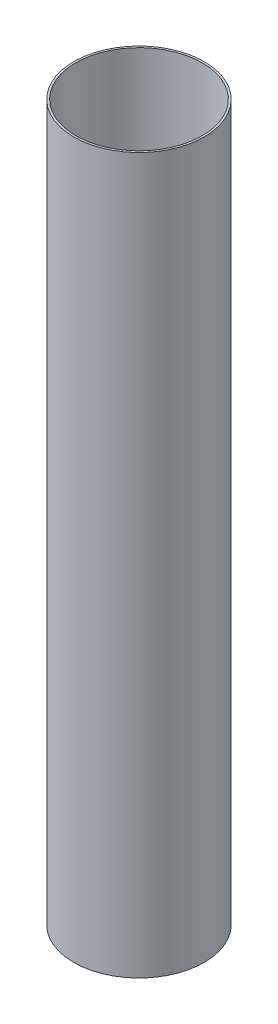
ISO-10303-21;
HEADER;
FILE_DESCRIPTION(('STEP AP214'),'2;1');
FILE_NAME('part.step','',(''),(''),'','','');
FILE_SCHEMA(('AUTOMOTIVE_DESIGN { 1 0 10303 214 1 1 1 1 }'));
ENDSEC;
DATA;
#1=APPLICATION_CONTEXT('core data for automotive mechanical design processes');
#2=APPLICATION_PROTOCOL_DEFINITION('international standard','automotive_design',2000,#1);
#3=PRODUCT_CONTEXT('',#1,'mechanical');
#4=PRODUCT('Part','Part','',(#3));
#5=PRODUCT_RELATED_PRODUCT_CATEGORY('part','',(#4));
#6=PRODUCT_DEFINITION_FORMATION('','',#4);
#7=PRODUCT_DEFINITION_CONTEXT('part definition',#1,'design');
#8=PRODUCT_DEFINITION('design','',#6,#7);
#9=PRODUCT_DEFINITION_SHAPE('','',#8);
#10=(LENGTH_UNIT() NAMED_UNIT(*) SI_UNIT(.MILLI.,.METRE.));
#11=(NAMED_UNIT(*) PLANE_ANGLE_UNIT() SI_UNIT($,.RADIAN.));
#12=(NAMED_UNIT(*) SI_UNIT($,.STERADIAN.) SOLID_ANGLE_UNIT());
#13=UNCERTAINTY_MEASURE_WITH_UNIT(LENGTH_MEASURE(1.E-05),#10,'distance_accuracy_value','');
#14=(GEOMETRIC_REPRESENTATION_CONTEXT(3) GLOBAL_UNCERTAINTY_ASSIGNED_CONTEXT((#13)) GLOBAL_UNIT_ASSIGNED_CONTEXT((#10,
#11,#12)) REPRESENTATION_CONTEXT('',''));
#15=CARTESIAN_POINT('',(0.,0.,0.));
#16=DIRECTION('',(0.,0.,1.));
#17=DIRECTION('',(1.,0.,0.));
#18=AXIS2_PLACEMENT_3D('',#15,#16,#17);
#19=CARTESIAN_POINT('',(0.,560.,0.));
#20=DIRECTION('',(0.,-1.,0.));
#21=DIRECTION('',(0.,0.,-1.));
#22=AXIS2_PLACEMENT_3D('',#19,#20,#21);
#23=CYLINDRICAL_SURFACE('',#22,51.105);
#24=CARTESIAN_POINT('',(0.,560.,0.));
#25=DIRECTION('',(0.,1.,0.));
#26=DIRECTION('',(0.,0.,1.));
#27=AXIS2_PLACEMENT_3D('',#24,#25,#26);
#28=CIRCLE('',#27,51.105);
#29=CARTESIAN_POINT('',(0.,560.,51.105));
#30=VERTEX_POINT('',#29);
#31=EDGE_CURVE('E10',#30,#30,#28,.T.);
#32=ORIENTED_EDGE('',*,*,#31,.F.);
#33=EDGE_LOOP('',(#32));
#34=FACE_BOUND('',#33,.T.);
#35=CARTESIAN_POINT('',(0.,0.,0.));
#36=DIRECTION('',(0.,1.,0.));
#37=DIRECTION('',(0.,0.,1.));
#38=AXIS2_PLACEMENT_3D('',#35,#36,#37);
#39=CIRCLE('',#38,51.105);
#40=CARTESIAN_POINT('',(0.,0.,51.105));
#41=VERTEX_POINT('',#40);
#42=EDGE_CURVE('E40',#41,#41,#39,.T.);
#43=ORIENTED_EDGE('',*,*,#42,.T.);
#44=EDGE_LOOP('',(#43));
#45=FACE_BOUND('',#44,.T.);
#46=ADVANCED_FACE('F37',(#34,#45),#23,.T.);
#47=CARTESIAN_POINT('',(0.,560.,0.));
#48=DIRECTION('',(0.,1.,0.));
#49=DIRECTION('',(0.,0.,1.));
#50=AXIS2_PLACEMENT_3D('',#47,#48,#49);
#51=PLANE('',#50);
#52=CARTESIAN_POINT('',(0.,560.,0.));
#53=DIRECTION('',(0.,-1.,0.));
#54=DIRECTION('',(0.,0.,-1.));
#55=AXIS2_PLACEMENT_3D('',#52,#53,#54);
#56=CIRCLE('',#55,49.53);
#57=CARTESIAN_POINT('',(0.,560.,-49.53));
#58=VERTEX_POINT('',#57);
#59=EDGE_CURVE('E47',#58,#58,#56,.T.);
#60=ORIENTED_EDGE('',*,*,#59,.T.);
#61=EDGE_LOOP('',(#60));
#62=FACE_BOUND('',#61,.T.);
#63=ORIENTED_EDGE('',*,*,#31,.T.);
#64=EDGE_LOOP('',(#63));
#65=FACE_BOUND('',#64,.T.);
#66=ADVANCED_FACE('F55',(#62,#65),#51,.T.);
#67=CARTESIAN_POINT('',(0.,0.,0.));
#68=DIRECTION('',(0.,1.,0.));
#69=DIRECTION('',(0.,0.,1.));
#70=AXIS2_PLACEMENT_3D('',#67,#68,#69);
#71=PLANE('',#70);
#72=CARTESIAN_POINT('',(0.,0.,0.));
#73=DIRECTION('',(0.,-1.,0.));
#74=DIRECTION('',(0.,0.,-1.));
#75=AXIS2_PLACEMENT_3D('',#72,#73,#74);
#76=CIRCLE('',#75,49.53);
#77=CARTESIAN_POINT('',(0.,0.,-49.53));
#78=VERTEX_POINT('',#77);
#79=EDGE_CURVE('E49',#78,#78,#76,.T.);
#80=ORIENTED_EDGE('',*,*,#79,.F.);
#81=EDGE_LOOP('',(#80));
#82=FACE_BOUND('',#81,.T.);
#83=ORIENTED_EDGE('',*,*,#42,.F.);
#84=EDGE_LOOP('',(#83));
#85=FACE_BOUND('',#84,.T.);
#86=ADVANCED_FACE('F60',(#82,#85),#71,.F.);
#87=CARTESIAN_POINT('',(0.,560.,0.));
#88=DIRECTION('',(0.,-1.,0.));
#89=DIRECTION('',(0.,0.,-1.));
#90=AXIS2_PLACEMENT_3D('',#87,#88,#89);
#91=CYLINDRICAL_SURFACE('',#90,49.53);
#92=ORIENTED_EDGE('',*,*,#59,.F.);
#93=EDGE_LOOP('',(#92));
#94=FACE_BOUND('',#93,.T.);
#95=ORIENTED_EDGE('',*,*,#79,.T.);
#96=EDGE_LOOP('',(#95));
#97=FACE_BOUND('',#96,.T.);
#98=ADVANCED_FACE('F57',(#94,#97),#91,.F.);
#99=CLOSED_SHELL('',(#46,#66,#86,#98));
#100=MANIFOLD_SOLID_BREP('B2',#99);
#101=ADVANCED_BREP_SHAPE_REPRESENTATION('',(#18,#100),#14);
#102=SHAPE_DEFINITION_REPRESENTATION(#9,#101);
ENDSEC;
END-ISO-10303-21;
